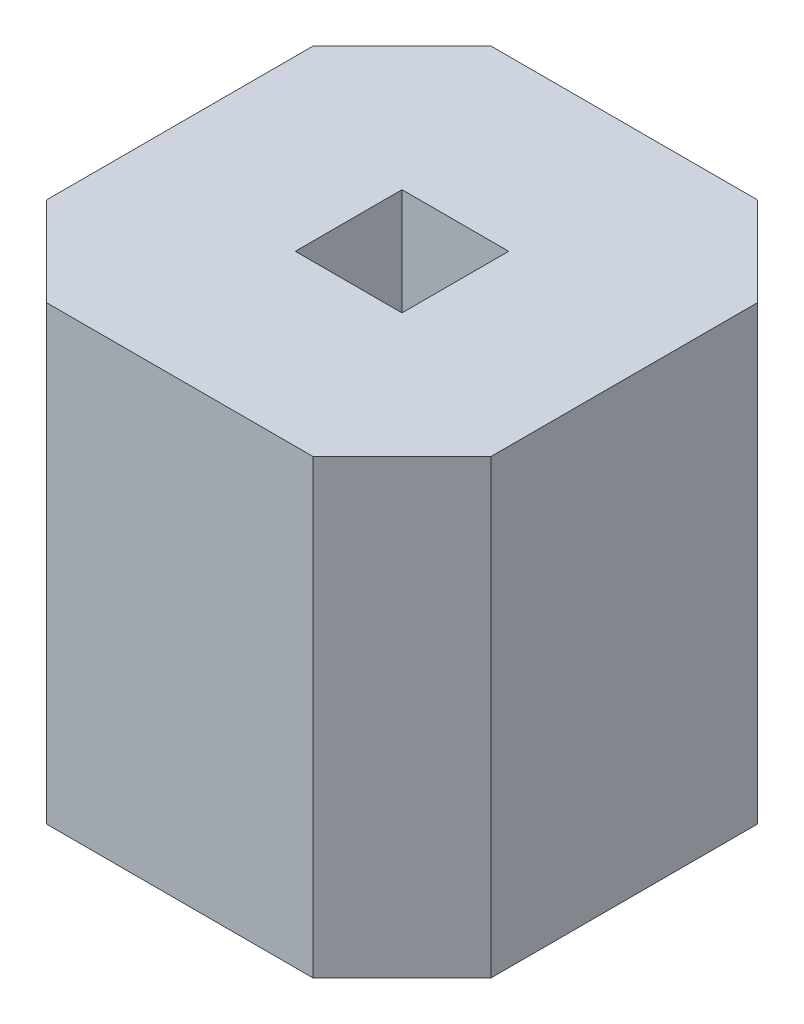
ISO-10303-21;
HEADER;
FILE_DESCRIPTION(('STEP AP214'),'2;1');
FILE_NAME('part.step','',(''),(''),'','','');
FILE_SCHEMA(('AUTOMOTIVE_DESIGN { 1 0 10303 214 1 1 1 1 }'));
ENDSEC;
DATA;
#1=APPLICATION_CONTEXT('core data for automotive mechanical design processes');
#2=APPLICATION_PROTOCOL_DEFINITION('international standard','automotive_design',2000,#1);
#3=PRODUCT_CONTEXT('',#1,'mechanical');
#4=PRODUCT('Part','Part','',(#3));
#5=PRODUCT_RELATED_PRODUCT_CATEGORY('part','',(#4));
#6=PRODUCT_DEFINITION_FORMATION('','',#4);
#7=PRODUCT_DEFINITION_CONTEXT('part definition',#1,'design');
#8=PRODUCT_DEFINITION('design','',#6,#7);
#9=PRODUCT_DEFINITION_SHAPE('','',#8);
#10=(LENGTH_UNIT() NAMED_UNIT(*) SI_UNIT(.MILLI.,.METRE.));
#11=(NAMED_UNIT(*) PLANE_ANGLE_UNIT() SI_UNIT($,.RADIAN.));
#12=(NAMED_UNIT(*) SI_UNIT($,.STERADIAN.) SOLID_ANGLE_UNIT());
#13=UNCERTAINTY_MEASURE_WITH_UNIT(LENGTH_MEASURE(1.E-05),#10,'distance_accuracy_value','');
#14=(GEOMETRIC_REPRESENTATION_CONTEXT(3) GLOBAL_UNCERTAINTY_ASSIGNED_CONTEXT((#13)) GLOBAL_UNIT_ASSIGNED_CONTEXT((#10,
#11,#12)) REPRESENTATION_CONTEXT('',''));
#15=CARTESIAN_POINT('',(0.,0.,0.));
#16=DIRECTION('',(0.,0.,1.));
#17=DIRECTION('',(1.,0.,0.));
#18=AXIS2_PLACEMENT_3D('',#15,#16,#17);
#19=CARTESIAN_POINT('',(1.25,2.54,1.25));
#20=DIRECTION('',(-1.,0.,0.));
#21=DIRECTION('',(0.,0.,1.));
#22=AXIS2_PLACEMENT_3D('',#19,#20,#21);
#23=PLANE('',#22);
#24=DIRECTION('',(0.,0.,-1.));
#25=VECTOR('',#24,1.);
#26=CARTESIAN_POINT('',(1.25,0.,1.25));
#27=LINE('',#26,#25);
#28=CARTESIAN_POINT('',(1.25,0.,0.749999999999998));
#29=VERTEX_POINT('',#28);
#30=CARTESIAN_POINT('',(1.25,0.,-0.749999999999999));
#31=VERTEX_POINT('',#30);
#32=EDGE_CURVE('E153',#29,#31,#27,.T.);
#33=ORIENTED_EDGE('',*,*,#32,.T.);
#34=DIRECTION('',(0.,1.,0.));
#35=VECTOR('',#34,1.);
#36=CARTESIAN_POINT('',(1.25,2.54,-0.749999999999999));
#37=LINE('',#36,#35);
#38=CARTESIAN_POINT('',(1.25,2.54,-0.749999999999999));
#39=VERTEX_POINT('',#38);
#40=EDGE_CURVE('E11',#31,#39,#37,.T.);
#41=ORIENTED_EDGE('',*,*,#40,.T.);
#42=DIRECTION('',(0.,0.,-1.));
#43=VECTOR('',#42,1.);
#44=CARTESIAN_POINT('',(1.25,2.54,1.25));
#45=LINE('',#44,#43);
#46=CARTESIAN_POINT('',(1.25,2.54,0.749999999999998));
#47=VERTEX_POINT('',#46);
#48=EDGE_CURVE('E157',#47,#39,#45,.T.);
#49=ORIENTED_EDGE('',*,*,#48,.F.);
#50=DIRECTION('',(0.,-1.,0.));
#51=VECTOR('',#50,1.);
#52=CARTESIAN_POINT('',(1.25,2.54,0.749999999999998));
#53=LINE('',#52,#51);
#54=EDGE_CURVE('E40',#47,#29,#53,.T.);
#55=ORIENTED_EDGE('',*,*,#54,.T.);
#56=EDGE_LOOP('',(#33,#41,#49,#55));
#57=FACE_BOUND('',#56,.T.);
#58=ADVANCED_FACE('F32',(#57),#23,.F.);
#59=CARTESIAN_POINT('',(-1.25,2.54,-1.25));
#60=DIRECTION('',(0.,0.,1.));
#61=DIRECTION('',(1.,0.,0.));
#62=AXIS2_PLACEMENT_3D('',#59,#60,#61);
#63=PLANE('',#62);
#64=DIRECTION('',(-1.,0.,0.));
#65=VECTOR('',#64,1.);
#66=CARTESIAN_POINT('',(-1.25,0.,-1.25));
#67=LINE('',#66,#65);
#68=CARTESIAN_POINT('',(0.749999999999999,0.,-1.25));
#69=VERTEX_POINT('',#68);
#70=CARTESIAN_POINT('',(-0.749999999999997,0.,-1.25));
#71=VERTEX_POINT('',#70);
#72=EDGE_CURVE('E173',#69,#71,#67,.T.);
#73=ORIENTED_EDGE('',*,*,#72,.T.);
#74=DIRECTION('',(0.,1.,0.));
#75=VECTOR('',#74,1.);
#76=CARTESIAN_POINT('',(-0.749999999999997,2.54,-1.25));
#77=LINE('',#76,#75);
#78=CARTESIAN_POINT('',(-0.749999999999997,2.54,-1.25));
#79=VERTEX_POINT('',#78);
#80=EDGE_CURVE('E209',#71,#79,#77,.T.);
#81=ORIENTED_EDGE('',*,*,#80,.T.);
#82=DIRECTION('',(-1.,0.,0.));
#83=VECTOR('',#82,1.);
#84=CARTESIAN_POINT('',(-1.25,2.54,-1.25));
#85=LINE('',#84,#83);
#86=CARTESIAN_POINT('',(0.749999999999999,2.54,-1.25));
#87=VERTEX_POINT('',#86);
#88=EDGE_CURVE('E160',#87,#79,#85,.T.);
#89=ORIENTED_EDGE('',*,*,#88,.F.);
#90=DIRECTION('',(0.,-1.,0.));
#91=VECTOR('',#90,1.);
#92=CARTESIAN_POINT('',(0.749999999999999,2.54,-1.25));
#93=LINE('',#92,#91);
#94=EDGE_CURVE('E206',#87,#69,#93,.T.);
#95=ORIENTED_EDGE('',*,*,#94,.T.);
#96=EDGE_LOOP('',(#73,#81,#89,#95));
#97=FACE_BOUND('',#96,.T.);
#98=ADVANCED_FACE('F226',(#97),#63,.F.);
#99=CARTESIAN_POINT('',(-1.25,2.54,1.25));
#100=DIRECTION('',(1.,0.,0.));
#101=DIRECTION('',(0.,0.,-1.));
#102=AXIS2_PLACEMENT_3D('',#99,#100,#101);
#103=PLANE('',#102);
#104=DIRECTION('',(0.,0.,1.));
#105=VECTOR('',#104,1.);
#106=CARTESIAN_POINT('',(-1.25,0.,1.25));
#107=LINE('',#106,#105);
#108=CARTESIAN_POINT('',(-1.25,0.,-0.749999999999998));
#109=VERTEX_POINT('',#108);
#110=CARTESIAN_POINT('',(-1.25,0.,0.749999999999999));
#111=VERTEX_POINT('',#110);
#112=EDGE_CURVE('E176',#109,#111,#107,.T.);
#113=ORIENTED_EDGE('',*,*,#112,.T.);
#114=DIRECTION('',(0.,1.,0.));
#115=VECTOR('',#114,1.);
#116=CARTESIAN_POINT('',(-1.25,2.54,0.749999999999999));
#117=LINE('',#116,#115);
#118=CARTESIAN_POINT('',(-1.25,2.54,0.749999999999999));
#119=VERTEX_POINT('',#118);
#120=EDGE_CURVE('E196',#111,#119,#117,.T.);
#121=ORIENTED_EDGE('',*,*,#120,.T.);
#122=DIRECTION('',(0.,0.,1.));
#123=VECTOR('',#122,1.);
#124=CARTESIAN_POINT('',(-1.25,2.54,1.25));
#125=LINE('',#124,#123);
#126=CARTESIAN_POINT('',(-1.25,2.54,-0.749999999999998));
#127=VERTEX_POINT('',#126);
#128=EDGE_CURVE('E164',#127,#119,#125,.T.);
#129=ORIENTED_EDGE('',*,*,#128,.F.);
#130=DIRECTION('',(0.,-1.,0.));
#131=VECTOR('',#130,1.);
#132=CARTESIAN_POINT('',(-1.25,2.54,-0.749999999999998));
#133=LINE('',#132,#131);
#134=EDGE_CURVE('E193',#127,#109,#133,.T.);
#135=ORIENTED_EDGE('',*,*,#134,.T.);
#136=EDGE_LOOP('',(#113,#121,#129,#135));
#137=FACE_BOUND('',#136,.T.);
#138=ADVANCED_FACE('F237',(#137),#103,.F.);
#139=CARTESIAN_POINT('',(-1.25,2.54,1.25));
#140=DIRECTION('',(0.,0.,-1.));
#141=DIRECTION('',(-1.,0.,0.));
#142=AXIS2_PLACEMENT_3D('',#139,#140,#141);
#143=PLANE('',#142);
#144=DIRECTION('',(1.,0.,0.));
#145=VECTOR('',#144,1.);
#146=CARTESIAN_POINT('',(-1.25,2.54,1.25));
#147=LINE('',#146,#145);
#148=CARTESIAN_POINT('',(-0.749999999999998,2.54,1.25));
#149=VERTEX_POINT('',#148);
#150=CARTESIAN_POINT('',(0.749999999999998,2.54,1.25));
#151=VERTEX_POINT('',#150);
#152=EDGE_CURVE('E167',#149,#151,#147,.T.);
#153=ORIENTED_EDGE('',*,*,#152,.F.);
#154=DIRECTION('',(0.,-1.,0.));
#155=VECTOR('',#154,1.);
#156=CARTESIAN_POINT('',(-0.749999999999998,2.54,1.25));
#157=LINE('',#156,#155);
#158=CARTESIAN_POINT('',(-0.749999999999998,0.,1.25));
#159=VERTEX_POINT('',#158);
#160=EDGE_CURVE('E182',#149,#159,#157,.T.);
#161=ORIENTED_EDGE('',*,*,#160,.T.);
#162=DIRECTION('',(1.,0.,0.));
#163=VECTOR('',#162,1.);
#164=CARTESIAN_POINT('',(-1.25,0.,1.25));
#165=LINE('',#164,#163);
#166=CARTESIAN_POINT('',(0.749999999999998,0.,1.25));
#167=VERTEX_POINT('',#166);
#168=EDGE_CURVE('E161',#159,#167,#165,.T.);
#169=ORIENTED_EDGE('',*,*,#168,.T.);
#170=DIRECTION('',(0.,1.,0.));
#171=VECTOR('',#170,1.);
#172=CARTESIAN_POINT('',(0.749999999999998,2.54,1.25));
#173=LINE('',#172,#171);
#174=EDGE_CURVE('E170',#167,#151,#173,.T.);
#175=ORIENTED_EDGE('',*,*,#174,.T.);
#176=EDGE_LOOP('',(#153,#161,#169,#175));
#177=FACE_BOUND('',#176,.T.);
#178=ADVANCED_FACE('F245',(#177),#143,.F.);
#179=CARTESIAN_POINT('',(0.,2.54,0.));
#180=DIRECTION('',(0.,-1.,0.));
#181=DIRECTION('',(0.,0.,-1.));
#182=AXIS2_PLACEMENT_3D('',#179,#180,#181);
#183=PLANE('',#182);
#184=DIRECTION('',(1.,0.,0.));
#185=VECTOR('',#184,1.);
#186=CARTESIAN_POINT('',(0.3,2.54,0.3));
#187=LINE('',#186,#185);
#188=CARTESIAN_POINT('',(-0.3,2.54,0.3));
#189=VERTEX_POINT('',#188);
#190=CARTESIAN_POINT('',(0.3,2.54,0.3));
#191=VERTEX_POINT('',#190);
#192=EDGE_CURVE('E147',#189,#191,#187,.T.);
#193=ORIENTED_EDGE('',*,*,#192,.F.);
#194=DIRECTION('',(0.,0.,1.));
#195=VECTOR('',#194,1.);
#196=CARTESIAN_POINT('',(-0.3,2.54,0.3));
#197=LINE('',#196,#195);
#198=CARTESIAN_POINT('',(-0.3,2.54,-0.3));
#199=VERTEX_POINT('',#198);
#200=EDGE_CURVE('E47',#199,#189,#197,.T.);
#201=ORIENTED_EDGE('',*,*,#200,.F.);
#202=DIRECTION('',(-1.,0.,0.));
#203=VECTOR('',#202,1.);
#204=CARTESIAN_POINT('',(0.3,2.54,-0.3));
#205=LINE('',#204,#203);
#206=CARTESIAN_POINT('',(0.3,2.54,-0.3));
#207=VERTEX_POINT('',#206);
#208=EDGE_CURVE('E138',#207,#199,#205,.T.);
#209=ORIENTED_EDGE('',*,*,#208,.F.);
#210=DIRECTION('',(0.,0.,-1.));
#211=VECTOR('',#210,1.);
#212=CARTESIAN_POINT('',(0.3,2.54,0.3));
#213=LINE('',#212,#211);
#214=EDGE_CURVE('E141',#191,#207,#213,.T.);
#215=ORIENTED_EDGE('',*,*,#214,.F.);
#216=EDGE_LOOP('',(#193,#201,#209,#215));
#217=FACE_BOUND('',#216,.T.);
#218=ORIENTED_EDGE('',*,*,#128,.T.);
#219=DIRECTION('',(-0.707106781186548,0.,-0.707106781186548));
#220=VECTOR('',#219,1.);
#221=CARTESIAN_POINT('',(-0.749999999999998,2.54,1.25));
#222=LINE('',#221,#220);
#223=EDGE_CURVE('E204',#119,#149,#222,.F.);
#224=ORIENTED_EDGE('',*,*,#223,.T.);
#225=ORIENTED_EDGE('',*,*,#152,.T.);
#226=DIRECTION('',(-0.707106781186548,0.,0.707106781186548));
#227=VECTOR('',#226,1.);
#228=CARTESIAN_POINT('',(1.25,2.54,0.749999999999998));
#229=LINE('',#228,#227);
#230=EDGE_CURVE('E198',#151,#47,#229,.F.);
#231=ORIENTED_EDGE('',*,*,#230,.T.);
#232=ORIENTED_EDGE('',*,*,#48,.T.);
#233=DIRECTION('',(0.707106781186548,0.,0.707106781186548));
#234=VECTOR('',#233,1.);
#235=CARTESIAN_POINT('',(0.749999999999999,2.54,-1.25));
#236=LINE('',#235,#234);
#237=EDGE_CURVE('E200',#39,#87,#236,.F.);
#238=ORIENTED_EDGE('',*,*,#237,.T.);
#239=ORIENTED_EDGE('',*,*,#88,.T.);
#240=DIRECTION('',(0.707106781186548,0.,-0.707106781186548));
#241=VECTOR('',#240,1.);
#242=CARTESIAN_POINT('',(-1.25,2.54,-0.749999999999998));
#243=LINE('',#242,#241);
#244=EDGE_CURVE('E202',#79,#127,#243,.F.);
#245=ORIENTED_EDGE('',*,*,#244,.T.);
#246=EDGE_LOOP('',(#218,#224,#225,#231,#232,#238,#239,#245));
#247=FACE_BOUND('',#246,.T.);
#248=ADVANCED_FACE('F230',(#217,#247),#183,.F.);
#249=CARTESIAN_POINT('',(0.,0.,0.));
#250=DIRECTION('',(0.,-1.,0.));
#251=DIRECTION('',(0.,0.,-1.));
#252=AXIS2_PLACEMENT_3D('',#249,#250,#251);
#253=PLANE('',#252);
#254=DIRECTION('',(0.,0.,1.));
#255=VECTOR('',#254,1.);
#256=CARTESIAN_POINT('',(-0.3,0.,0.3));
#257=LINE('',#256,#255);
#258=CARTESIAN_POINT('',(-0.3,0.,-0.3));
#259=VERTEX_POINT('',#258);
#260=CARTESIAN_POINT('',(-0.3,0.,0.3));
#261=VERTEX_POINT('',#260);
#262=EDGE_CURVE('E122',#259,#261,#257,.T.);
#263=ORIENTED_EDGE('',*,*,#262,.T.);
#264=DIRECTION('',(1.,0.,0.));
#265=VECTOR('',#264,1.);
#266=CARTESIAN_POINT('',(0.3,0.,0.3));
#267=LINE('',#266,#265);
#268=CARTESIAN_POINT('',(0.3,0.,0.3));
#269=VERTEX_POINT('',#268);
#270=EDGE_CURVE('E131',#261,#269,#267,.T.);
#271=ORIENTED_EDGE('',*,*,#270,.T.);
#272=DIRECTION('',(0.,0.,-1.));
#273=VECTOR('',#272,1.);
#274=CARTESIAN_POINT('',(0.3,0.,0.3));
#275=LINE('',#274,#273);
#276=CARTESIAN_POINT('',(0.3,0.,-0.3));
#277=VERTEX_POINT('',#276);
#278=EDGE_CURVE('E55',#269,#277,#275,.T.);
#279=ORIENTED_EDGE('',*,*,#278,.T.);
#280=DIRECTION('',(-1.,0.,0.));
#281=VECTOR('',#280,1.);
#282=CARTESIAN_POINT('',(0.3,0.,-0.3));
#283=LINE('',#282,#281);
#284=EDGE_CURVE('E128',#277,#259,#283,.T.);
#285=ORIENTED_EDGE('',*,*,#284,.T.);
#286=EDGE_LOOP('',(#263,#271,#279,#285));
#287=FACE_BOUND('',#286,.T.);
#288=ORIENTED_EDGE('',*,*,#168,.F.);
#289=DIRECTION('',(0.707106781186548,0.,0.707106781186548));
#290=VECTOR('',#289,1.);
#291=CARTESIAN_POINT('',(-0.999999999999999,0.,0.999999999999999));
#292=LINE('',#291,#290);
#293=EDGE_CURVE('E191',#159,#111,#292,.F.);
#294=ORIENTED_EDGE('',*,*,#293,.T.);
#295=ORIENTED_EDGE('',*,*,#112,.F.);
#296=DIRECTION('',(-0.707106781186548,0.,0.707106781186548));
#297=VECTOR('',#296,1.);
#298=CARTESIAN_POINT('',(-0.999999999999999,0.,-0.999999999999999));
#299=LINE('',#298,#297);
#300=EDGE_CURVE('E189',#109,#71,#299,.F.);
#301=ORIENTED_EDGE('',*,*,#300,.T.);
#302=ORIENTED_EDGE('',*,*,#72,.F.);
#303=DIRECTION('',(-0.707106781186548,0.,-0.707106781186548));
#304=VECTOR('',#303,1.);
#305=CARTESIAN_POINT('',(1.,0.,-1.));
#306=LINE('',#305,#304);
#307=EDGE_CURVE('E187',#69,#31,#306,.F.);
#308=ORIENTED_EDGE('',*,*,#307,.T.);
#309=ORIENTED_EDGE('',*,*,#32,.F.);
#310=DIRECTION('',(0.707106781186548,0.,-0.707106781186548));
#311=VECTOR('',#310,1.);
#312=CARTESIAN_POINT('',(0.999999999999999,0.,0.999999999999999));
#313=LINE('',#312,#311);
#314=EDGE_CURVE('E185',#29,#167,#313,.F.);
#315=ORIENTED_EDGE('',*,*,#314,.T.);
#316=EDGE_LOOP('',(#288,#294,#295,#301,#302,#308,#309,#315));
#317=FACE_BOUND('',#316,.T.);
#318=ADVANCED_FACE('F135',(#287,#317),#253,.T.);
#319=CARTESIAN_POINT('',(-0.749999999999998,2.54,1.25));
#320=DIRECTION('',(0.707106781186548,0.,-0.707106781186548));
#321=DIRECTION('',(0.,-1.,0.));
#322=AXIS2_PLACEMENT_3D('',#319,#320,#321);
#323=PLANE('',#322);
#324=ORIENTED_EDGE('',*,*,#223,.F.);
#325=ORIENTED_EDGE('',*,*,#120,.F.);
#326=ORIENTED_EDGE('',*,*,#293,.F.);
#327=ORIENTED_EDGE('',*,*,#160,.F.);
#328=EDGE_LOOP('',(#324,#325,#326,#327));
#329=FACE_BOUND('',#328,.T.);
#330=ADVANCED_FACE('F242',(#329),#323,.F.);
#331=CARTESIAN_POINT('',(-1.25,2.54,-0.749999999999998));
#332=DIRECTION('',(0.707106781186548,0.,0.707106781186548));
#333=DIRECTION('',(0.,-1.,0.));
#334=AXIS2_PLACEMENT_3D('',#331,#332,#333);
#335=PLANE('',#334);
#336=ORIENTED_EDGE('',*,*,#244,.F.);
#337=ORIENTED_EDGE('',*,*,#80,.F.);
#338=ORIENTED_EDGE('',*,*,#300,.F.);
#339=ORIENTED_EDGE('',*,*,#134,.F.);
#340=EDGE_LOOP('',(#336,#337,#338,#339));
#341=FACE_BOUND('',#340,.T.);
#342=ADVANCED_FACE('F234',(#341),#335,.F.);
#343=CARTESIAN_POINT('',(0.749999999999999,2.54,-1.25));
#344=DIRECTION('',(-0.707106781186548,0.,0.707106781186548));
#345=DIRECTION('',(0.,-1.,0.));
#346=AXIS2_PLACEMENT_3D('',#343,#344,#345);
#347=PLANE('',#346);
#348=ORIENTED_EDGE('',*,*,#237,.F.);
#349=ORIENTED_EDGE('',*,*,#40,.F.);
#350=ORIENTED_EDGE('',*,*,#307,.F.);
#351=ORIENTED_EDGE('',*,*,#94,.F.);
#352=EDGE_LOOP('',(#348,#349,#350,#351));
#353=FACE_BOUND('',#352,.T.);
#354=ADVANCED_FACE('F223',(#353),#347,.F.);
#355=CARTESIAN_POINT('',(1.25,2.54,0.749999999999998));
#356=DIRECTION('',(-0.707106781186548,0.,-0.707106781186548));
#357=DIRECTION('',(0.,-1.,0.));
#358=AXIS2_PLACEMENT_3D('',#355,#356,#357);
#359=PLANE('',#358);
#360=ORIENTED_EDGE('',*,*,#230,.F.);
#361=ORIENTED_EDGE('',*,*,#174,.F.);
#362=ORIENTED_EDGE('',*,*,#314,.F.);
#363=ORIENTED_EDGE('',*,*,#54,.F.);
#364=EDGE_LOOP('',(#360,#361,#362,#363));
#365=FACE_BOUND('',#364,.T.);
#366=ADVANCED_FACE('F34',(#365),#359,.F.);
#367=CARTESIAN_POINT('',(-0.3,0.,0.3));
#368=DIRECTION('',(-1.,0.,0.));
#369=DIRECTION('',(0.,0.,1.));
#370=AXIS2_PLACEMENT_3D('',#367,#368,#369);
#371=PLANE('',#370);
#372=ORIENTED_EDGE('',*,*,#200,.T.);
#373=DIRECTION('',(0.,1.,0.));
#374=VECTOR('',#373,1.);
#375=CARTESIAN_POINT('',(-0.3,0.,0.3));
#376=LINE('',#375,#374);
#377=EDGE_CURVE('E118',#261,#189,#376,.T.);
#378=ORIENTED_EDGE('',*,*,#377,.F.);
#379=ORIENTED_EDGE('',*,*,#262,.F.);
#380=DIRECTION('',(0.,1.,0.));
#381=VECTOR('',#380,1.);
#382=CARTESIAN_POINT('',(-0.3,0.,-0.3));
#383=LINE('',#382,#381);
#384=EDGE_CURVE('E151',#259,#199,#383,.T.);
#385=ORIENTED_EDGE('',*,*,#384,.T.);
#386=EDGE_LOOP('',(#372,#378,#379,#385));
#387=FACE_BOUND('',#386,.T.);
#388=ADVANCED_FACE('F120',(#387),#371,.F.);
#389=CARTESIAN_POINT('',(0.3,0.,-0.3));
#390=DIRECTION('',(0.,0.,-1.));
#391=DIRECTION('',(-1.,0.,0.));
#392=AXIS2_PLACEMENT_3D('',#389,#390,#391);
#393=PLANE('',#392);
#394=ORIENTED_EDGE('',*,*,#208,.T.);
#395=ORIENTED_EDGE('',*,*,#384,.F.);
#396=ORIENTED_EDGE('',*,*,#284,.F.);
#397=DIRECTION('',(0.,1.,0.));
#398=VECTOR('',#397,1.);
#399=CARTESIAN_POINT('',(0.3,0.,-0.3));
#400=LINE('',#399,#398);
#401=EDGE_CURVE('E154',#277,#207,#400,.T.);
#402=ORIENTED_EDGE('',*,*,#401,.T.);
#403=EDGE_LOOP('',(#394,#395,#396,#402));
#404=FACE_BOUND('',#403,.T.);
#405=ADVANCED_FACE('F252',(#404),#393,.F.);
#406=CARTESIAN_POINT('',(0.3,0.,0.3));
#407=DIRECTION('',(1.,0.,0.));
#408=DIRECTION('',(0.,0.,-1.));
#409=AXIS2_PLACEMENT_3D('',#406,#407,#408);
#410=PLANE('',#409);
#411=ORIENTED_EDGE('',*,*,#214,.T.);
#412=ORIENTED_EDGE('',*,*,#401,.F.);
#413=ORIENTED_EDGE('',*,*,#278,.F.);
#414=DIRECTION('',(0.,1.,0.));
#415=VECTOR('',#414,1.);
#416=CARTESIAN_POINT('',(0.3,0.,0.3));
#417=LINE('',#416,#415);
#418=EDGE_CURVE('E127',#269,#191,#417,.T.);
#419=ORIENTED_EDGE('',*,*,#418,.T.);
#420=EDGE_LOOP('',(#411,#412,#413,#419));
#421=FACE_BOUND('',#420,.T.);
#422=ADVANCED_FACE('F312',(#421),#410,.F.);
#423=CARTESIAN_POINT('',(0.3,0.,0.3));
#424=DIRECTION('',(0.,0.,1.));
#425=DIRECTION('',(1.,0.,0.));
#426=AXIS2_PLACEMENT_3D('',#423,#424,#425);
#427=PLANE('',#426);
#428=ORIENTED_EDGE('',*,*,#192,.T.);
#429=ORIENTED_EDGE('',*,*,#418,.F.);
#430=ORIENTED_EDGE('',*,*,#270,.F.);
#431=ORIENTED_EDGE('',*,*,#377,.T.);
#432=EDGE_LOOP('',(#428,#429,#430,#431));
#433=FACE_BOUND('',#432,.T.);
#434=ADVANCED_FACE('F132',(#433),#427,.F.);
#435=CLOSED_SHELL('',(#58,#98,#138,#178,#248,#318,#330,#342,#354,#366,#388,#405,#422,#434));
#436=MANIFOLD_SOLID_BREP('B2',#435);
#437=ADVANCED_BREP_SHAPE_REPRESENTATION('',(#18,#436),#14);
#438=SHAPE_DEFINITION_REPRESENTATION(#9,#437);
ENDSEC;
END-ISO-10303-21;
